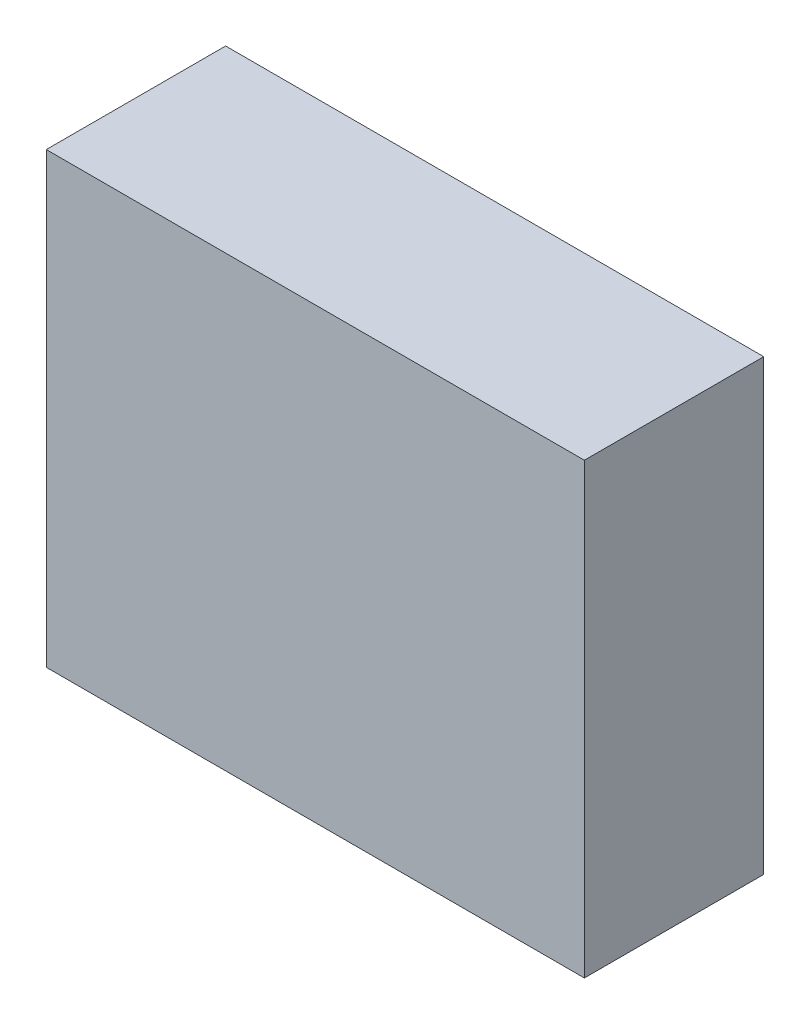
ISO-10303-21;
HEADER;
FILE_DESCRIPTION(('STEP AP214'),'2;1');
FILE_NAME('part.step','',(''),(''),'','','');
FILE_SCHEMA(('AUTOMOTIVE_DESIGN { 1 0 10303 214 1 1 1 1 }'));
ENDSEC;
DATA;
#1=APPLICATION_CONTEXT('core data for automotive mechanical design processes');
#2=APPLICATION_PROTOCOL_DEFINITION('international standard','automotive_design',2000,#1);
#3=PRODUCT_CONTEXT('',#1,'mechanical');
#4=PRODUCT('Part','Part','',(#3));
#5=PRODUCT_RELATED_PRODUCT_CATEGORY('part','',(#4));
#6=PRODUCT_DEFINITION_FORMATION('','',#4);
#7=PRODUCT_DEFINITION_CONTEXT('part definition',#1,'design');
#8=PRODUCT_DEFINITION('design','',#6,#7);
#9=PRODUCT_DEFINITION_SHAPE('','',#8);
#10=(LENGTH_UNIT() NAMED_UNIT(*) SI_UNIT(.MILLI.,.METRE.));
#11=(NAMED_UNIT(*) PLANE_ANGLE_UNIT() SI_UNIT($,.RADIAN.));
#12=(NAMED_UNIT(*) SI_UNIT($,.STERADIAN.) SOLID_ANGLE_UNIT());
#13=UNCERTAINTY_MEASURE_WITH_UNIT(LENGTH_MEASURE(1.E-05),#10,'distance_accuracy_value','');
#14=(GEOMETRIC_REPRESENTATION_CONTEXT(3) GLOBAL_UNCERTAINTY_ASSIGNED_CONTEXT((#13)) GLOBAL_UNIT_ASSIGNED_CONTEXT((#10,
#11,#12)) REPRESENTATION_CONTEXT('',''));
#15=CARTESIAN_POINT('',(0.,0.,0.));
#16=DIRECTION('',(0.,0.,1.));
#17=DIRECTION('',(1.,0.,0.));
#18=AXIS2_PLACEMENT_3D('',#15,#16,#17);
#19=CARTESIAN_POINT('',(-30.,40.,10.));
#20=DIRECTION('',(1.,0.,0.));
#21=DIRECTION('',(0.,0.,-1.));
#22=AXIS2_PLACEMENT_3D('',#19,#20,#21);
#23=PLANE('',#22);
#24=DIRECTION('',(0.,-1.,0.));
#25=VECTOR('',#24,1.);
#26=CARTESIAN_POINT('',(-30.,40.,-10.));
#27=LINE('',#26,#25);
#28=CARTESIAN_POINT('',(-30.,40.,-10.));
#29=VERTEX_POINT('',#28);
#30=CARTESIAN_POINT('',(-30.,-10.,-10.));
#31=VERTEX_POINT('',#30);
#32=EDGE_CURVE('E130',#29,#31,#27,.T.);
#33=ORIENTED_EDGE('',*,*,#32,.T.);
#34=DIRECTION('',(0.,0.,-1.));
#35=VECTOR('',#34,1.);
#36=CARTESIAN_POINT('',(-30.,-10.,10.));
#37=LINE('',#36,#35);
#38=CARTESIAN_POINT('',(-30.,-10.,10.));
#39=VERTEX_POINT('',#38);
#40=EDGE_CURVE('E179',#39,#31,#37,.T.);
#41=ORIENTED_EDGE('',*,*,#40,.F.);
#42=DIRECTION('',(0.,-1.,0.));
#43=VECTOR('',#42,1.);
#44=CARTESIAN_POINT('',(-30.,40.,10.));
#45=LINE('',#44,#43);
#46=CARTESIAN_POINT('',(-30.,40.,10.));
#47=VERTEX_POINT('',#46);
#48=EDGE_CURVE('E159',#47,#39,#45,.T.);
#49=ORIENTED_EDGE('',*,*,#48,.F.);
#50=DIRECTION('',(0.,0.,-1.));
#51=VECTOR('',#50,1.);
#52=CARTESIAN_POINT('',(-30.,40.,10.));
#53=LINE('',#52,#51);
#54=EDGE_CURVE('E165',#47,#29,#53,.T.);
#55=ORIENTED_EDGE('',*,*,#54,.T.);
#56=EDGE_LOOP('',(#33,#41,#49,#55));
#57=FACE_BOUND('',#56,.T.);
#58=ADVANCED_FACE('F41',(#57),#23,.F.);
#59=CARTESIAN_POINT('',(-30.,-10.,10.));
#60=DIRECTION('',(0.,1.,0.));
#61=DIRECTION('',(0.,0.,1.));
#62=AXIS2_PLACEMENT_3D('',#59,#60,#61);
#63=PLANE('',#62);
#64=DIRECTION('',(1.,0.,0.));
#65=VECTOR('',#64,1.);
#66=CARTESIAN_POINT('',(-30.,-10.,-10.));
#67=LINE('',#66,#65);
#68=CARTESIAN_POINT('',(30.,-10.,-10.));
#69=VERTEX_POINT('',#68);
#70=EDGE_CURVE('E168',#31,#69,#67,.T.);
#71=ORIENTED_EDGE('',*,*,#70,.T.);
#72=DIRECTION('',(0.,0.,-1.));
#73=VECTOR('',#72,1.);
#74=CARTESIAN_POINT('',(30.,-10.,10.));
#75=LINE('',#74,#73);
#76=CARTESIAN_POINT('',(30.,-10.,10.));
#77=VERTEX_POINT('',#76);
#78=EDGE_CURVE('E176',#77,#69,#75,.T.);
#79=ORIENTED_EDGE('',*,*,#78,.F.);
#80=DIRECTION('',(1.,0.,0.));
#81=VECTOR('',#80,1.);
#82=CARTESIAN_POINT('',(-30.,-10.,10.));
#83=LINE('',#82,#81);
#84=EDGE_CURVE('E93',#39,#77,#83,.T.);
#85=ORIENTED_EDGE('',*,*,#84,.F.);
#86=ORIENTED_EDGE('',*,*,#40,.T.);
#87=EDGE_LOOP('',(#71,#79,#85,#86));
#88=FACE_BOUND('',#87,.T.);
#89=ADVANCED_FACE('F207',(#88),#63,.F.);
#90=CARTESIAN_POINT('',(30.,-10.,10.));
#91=DIRECTION('',(-1.,0.,0.));
#92=DIRECTION('',(0.,0.,1.));
#93=AXIS2_PLACEMENT_3D('',#90,#91,#92);
#94=PLANE('',#93);
#95=DIRECTION('',(0.,1.,0.));
#96=VECTOR('',#95,1.);
#97=CARTESIAN_POINT('',(30.,-10.,-10.));
#98=LINE('',#97,#96);
#99=CARTESIAN_POINT('',(30.,40.,-10.));
#100=VERTEX_POINT('',#99);
#101=EDGE_CURVE('E170',#69,#100,#98,.T.);
#102=ORIENTED_EDGE('',*,*,#101,.T.);
#103=DIRECTION('',(0.,0.,-1.));
#104=VECTOR('',#103,1.);
#105=CARTESIAN_POINT('',(30.,40.,10.));
#106=LINE('',#105,#104);
#107=CARTESIAN_POINT('',(30.,40.,10.));
#108=VERTEX_POINT('',#107);
#109=EDGE_CURVE('E174',#108,#100,#106,.T.);
#110=ORIENTED_EDGE('',*,*,#109,.F.);
#111=DIRECTION('',(0.,1.,0.));
#112=VECTOR('',#111,1.);
#113=CARTESIAN_POINT('',(30.,-10.,10.));
#114=LINE('',#113,#112);
#115=EDGE_CURVE('E162',#77,#108,#114,.T.);
#116=ORIENTED_EDGE('',*,*,#115,.F.);
#117=ORIENTED_EDGE('',*,*,#78,.T.);
#118=EDGE_LOOP('',(#102,#110,#116,#117));
#119=FACE_BOUND('',#118,.T.);
#120=ADVANCED_FACE('F212',(#119),#94,.F.);
#121=CARTESIAN_POINT('',(30.,40.,10.));
#122=DIRECTION('',(0.,-1.,0.));
#123=DIRECTION('',(0.,0.,-1.));
#124=AXIS2_PLACEMENT_3D('',#121,#122,#123);
#125=PLANE('',#124);
#126=DIRECTION('',(-1.,0.,0.));
#127=VECTOR('',#126,1.);
#128=CARTESIAN_POINT('',(30.,40.,-10.));
#129=LINE('',#128,#127);
#130=EDGE_CURVE('E85',#100,#29,#129,.T.);
#131=ORIENTED_EDGE('',*,*,#130,.T.);
#132=ORIENTED_EDGE('',*,*,#54,.F.);
#133=DIRECTION('',(-1.,0.,0.));
#134=VECTOR('',#133,1.);
#135=CARTESIAN_POINT('',(30.,40.,10.));
#136=LINE('',#135,#134);
#137=EDGE_CURVE('E64',#108,#47,#136,.T.);
#138=ORIENTED_EDGE('',*,*,#137,.F.);
#139=ORIENTED_EDGE('',*,*,#109,.T.);
#140=EDGE_LOOP('',(#131,#132,#138,#139));
#141=FACE_BOUND('',#140,.T.);
#142=ADVANCED_FACE('F222',(#141),#125,.F.);
#143=CARTESIAN_POINT('',(0.,0.,10.));
#144=DIRECTION('',(0.,0.,1.));
#145=DIRECTION('',(1.,0.,0.));
#146=AXIS2_PLACEMENT_3D('',#143,#144,#145);
#147=PLANE('',#146);
#148=ORIENTED_EDGE('',*,*,#48,.T.);
#149=ORIENTED_EDGE('',*,*,#84,.T.);
#150=ORIENTED_EDGE('',*,*,#115,.T.);
#151=ORIENTED_EDGE('',*,*,#137,.T.);
#152=EDGE_LOOP('',(#148,#149,#150,#151));
#153=FACE_BOUND('',#152,.T.);
#154=ADVANCED_FACE('F220',(#153),#147,.T.);
#155=CARTESIAN_POINT('',(0.,0.,-10.));
#156=DIRECTION('',(0.,0.,1.));
#157=DIRECTION('',(1.,0.,0.));
#158=AXIS2_PLACEMENT_3D('',#155,#156,#157);
#159=PLANE('',#158);
#160=DIRECTION('',(0.,1.,0.));
#161=VECTOR('',#160,1.);
#162=CARTESIAN_POINT('',(-5.77350269189625,0.,-10.));
#163=LINE('',#162,#161);
#164=CARTESIAN_POINT('',(-5.77350269189625,0.,-10.));
#165=VERTEX_POINT('',#164);
#166=CARTESIAN_POINT('',(-5.77350269189626,30.,-10.));
#167=VERTEX_POINT('',#166);
#168=EDGE_CURVE('E181',#165,#167,#163,.T.);
#169=ORIENTED_EDGE('',*,*,#168,.F.);
#170=DIRECTION('',(1.,0.,0.));
#171=VECTOR('',#170,1.);
#172=CARTESIAN_POINT('',(0.,0.,-10.));
#173=LINE('',#172,#171);
#174=CARTESIAN_POINT('',(17.3205080756888,0.,-10.));
#175=VERTEX_POINT('',#174);
#176=EDGE_CURVE('E11',#165,#175,#173,.T.);
#177=ORIENTED_EDGE('',*,*,#176,.T.);
#178=DIRECTION('',(0.,-1.,0.));
#179=VECTOR('',#178,1.);
#180=CARTESIAN_POINT('',(17.3205080756888,0.,-10.));
#181=LINE('',#180,#179);
#182=CARTESIAN_POINT('',(17.3205080756888,30.,-10.));
#183=VERTEX_POINT('',#182);
#184=EDGE_CURVE('E48',#175,#183,#181,.F.);
#185=ORIENTED_EDGE('',*,*,#184,.T.);
#186=DIRECTION('',(-1.,0.,0.));
#187=VECTOR('',#186,1.);
#188=CARTESIAN_POINT('',(0.,30.,-10.));
#189=LINE('',#188,#187);
#190=EDGE_CURVE('E183',#183,#167,#189,.T.);
#191=ORIENTED_EDGE('',*,*,#190,.T.);
#192=EDGE_LOOP('',(#169,#177,#185,#191));
#193=FACE_BOUND('',#192,.T.);
#194=ORIENTED_EDGE('',*,*,#32,.F.);
#195=ORIENTED_EDGE('',*,*,#130,.F.);
#196=ORIENTED_EDGE('',*,*,#101,.F.);
#197=ORIENTED_EDGE('',*,*,#70,.F.);
#198=EDGE_LOOP('',(#194,#195,#196,#197));
#199=FACE_BOUND('',#198,.T.);
#200=ADVANCED_FACE('F188',(#193,#199),#159,.F.);
#201=CARTESIAN_POINT('',(-2.5,0.,-4.33012701892219));
#202=DIRECTION('',(0.,-1.,0.));
#203=DIRECTION('',(0.,0.,-1.));
#204=AXIS2_PLACEMENT_3D('',#201,#202,#203);
#205=PLANE('',#204);
#206=DIRECTION('',(-0.5,0.,-0.866025403784439));
#207=VECTOR('',#206,1.);
#208=CARTESIAN_POINT('',(-2.5,0.,-4.33012701892219));
#209=LINE('',#208,#207);
#210=CARTESIAN_POINT('',(-2.5,0.,-4.33012701892219));
#211=VERTEX_POINT('',#210);
#212=EDGE_CURVE('E55',#211,#165,#209,.T.);
#213=ORIENTED_EDGE('',*,*,#212,.F.);
#214=CARTESIAN_POINT('',(0.,0.,0.));
#215=DIRECTION('',(0.,-1.,0.));
#216=DIRECTION('',(0.,0.,-1.));
#217=AXIS2_PLACEMENT_3D('',#214,#215,#216);
#218=CIRCLE('',#217,5.);
#219=CARTESIAN_POINT('',(5.,0.,0.));
#220=VERTEX_POINT('',#219);
#221=EDGE_CURVE('E121',#211,#220,#218,.T.);
#222=ORIENTED_EDGE('',*,*,#221,.T.);
#223=DIRECTION('',(1.,0.,0.));
#224=VECTOR('',#223,1.);
#225=CARTESIAN_POINT('',(5.,0.,0.));
#226=LINE('',#225,#224);
#227=CARTESIAN_POINT('',(20.,0.,0.));
#228=VERTEX_POINT('',#227);
#229=EDGE_CURVE('E126',#220,#228,#226,.T.);
#230=ORIENTED_EDGE('',*,*,#229,.T.);
#231=CARTESIAN_POINT('',(0.,0.,0.));
#232=DIRECTION('',(0.,-1.,0.));
#233=DIRECTION('',(0.,0.,-1.));
#234=AXIS2_PLACEMENT_3D('',#231,#232,#233);
#235=CIRCLE('',#234,20.);
#236=EDGE_CURVE('E131',#175,#228,#235,.T.);
#237=ORIENTED_EDGE('',*,*,#236,.F.);
#238=ORIENTED_EDGE('',*,*,#176,.F.);
#239=EDGE_LOOP('',(#213,#222,#230,#237,#238));
#240=FACE_BOUND('',#239,.T.);
#241=ADVANCED_FACE('F123',(#240),#205,.F.);
#242=CARTESIAN_POINT('',(0.,0.,0.));
#243=DIRECTION('',(0.,-1.,0.));
#244=DIRECTION('',(0.,0.,-1.));
#245=AXIS2_PLACEMENT_3D('',#242,#243,#244);
#246=CYLINDRICAL_SURFACE('',#245,20.);
#247=ORIENTED_EDGE('',*,*,#236,.T.);
#248=DIRECTION('',(0.,1.,0.));
#249=VECTOR('',#248,1.);
#250=CARTESIAN_POINT('',(20.,0.,0.));
#251=LINE('',#250,#249);
#252=CARTESIAN_POINT('',(20.,30.,0.));
#253=VERTEX_POINT('',#252);
#254=EDGE_CURVE('E144',#228,#253,#251,.T.);
#255=ORIENTED_EDGE('',*,*,#254,.T.);
#256=CARTESIAN_POINT('',(0.,30.,0.));
#257=DIRECTION('',(0.,-1.,0.));
#258=DIRECTION('',(0.,0.,-1.));
#259=AXIS2_PLACEMENT_3D('',#256,#257,#258);
#260=CIRCLE('',#259,20.);
#261=EDGE_CURVE('E156',#183,#253,#260,.T.);
#262=ORIENTED_EDGE('',*,*,#261,.F.);
#263=ORIENTED_EDGE('',*,*,#184,.F.);
#264=EDGE_LOOP('',(#247,#255,#262,#263));
#265=FACE_BOUND('',#264,.T.);
#266=ADVANCED_FACE('F192',(#265),#246,.F.);
#267=CARTESIAN_POINT('',(-9.99999999999999,30.,-17.3205080756888));
#268=DIRECTION('',(0.,1.,0.));
#269=DIRECTION('',(0.,0.,1.));
#270=AXIS2_PLACEMENT_3D('',#267,#268,#269);
#271=PLANE('',#270);
#272=ORIENTED_EDGE('',*,*,#261,.T.);
#273=DIRECTION('',(-1.,0.,0.));
#274=VECTOR('',#273,1.);
#275=CARTESIAN_POINT('',(20.,30.,0.));
#276=LINE('',#275,#274);
#277=CARTESIAN_POINT('',(5.,30.,0.));
#278=VERTEX_POINT('',#277);
#279=EDGE_CURVE('E146',#253,#278,#276,.T.);
#280=ORIENTED_EDGE('',*,*,#279,.T.);
#281=CARTESIAN_POINT('',(0.,30.,0.));
#282=DIRECTION('',(0.,-1.,0.));
#283=DIRECTION('',(0.,0.,-1.));
#284=AXIS2_PLACEMENT_3D('',#281,#282,#283);
#285=CIRCLE('',#284,5.);
#286=CARTESIAN_POINT('',(-2.5,30.,-4.33012701892219));
#287=VERTEX_POINT('',#286);
#288=EDGE_CURVE('E137',#287,#278,#285,.T.);
#289=ORIENTED_EDGE('',*,*,#288,.F.);
#290=DIRECTION('',(0.5,0.,0.866025403784439));
#291=VECTOR('',#290,1.);
#292=CARTESIAN_POINT('',(-9.99999999999999,30.,-17.3205080756888));
#293=LINE('',#292,#291);
#294=EDGE_CURVE('E153',#167,#287,#293,.T.);
#295=ORIENTED_EDGE('',*,*,#294,.F.);
#296=ORIENTED_EDGE('',*,*,#190,.F.);
#297=EDGE_LOOP('',(#272,#280,#289,#295,#296));
#298=FACE_BOUND('',#297,.T.);
#299=ADVANCED_FACE('F196',(#298),#271,.F.);
#300=CARTESIAN_POINT('',(0.,0.,0.));
#301=DIRECTION('',(0.866025403784439,0.,-0.5));
#302=DIRECTION('',(-0.5,0.,-0.866025403784439));
#303=AXIS2_PLACEMENT_3D('',#300,#301,#302);
#304=PLANE('',#303);
#305=ORIENTED_EDGE('',*,*,#168,.T.);
#306=ORIENTED_EDGE('',*,*,#294,.T.);
#307=DIRECTION('',(0.,-1.,0.));
#308=VECTOR('',#307,1.);
#309=CARTESIAN_POINT('',(-2.5,30.,-4.33012701892219));
#310=LINE('',#309,#308);
#311=EDGE_CURVE('E150',#287,#211,#310,.T.);
#312=ORIENTED_EDGE('',*,*,#311,.T.);
#313=ORIENTED_EDGE('',*,*,#212,.T.);
#314=EDGE_LOOP('',(#305,#306,#312,#313));
#315=FACE_BOUND('',#314,.T.);
#316=ADVANCED_FACE('F194',(#315),#304,.T.);
#317=CARTESIAN_POINT('',(0.,0.,0.));
#318=DIRECTION('',(0.,-1.,0.));
#319=DIRECTION('',(0.,0.,-1.));
#320=AXIS2_PLACEMENT_3D('',#317,#318,#319);
#321=CYLINDRICAL_SURFACE('',#320,5.);
#322=ORIENTED_EDGE('',*,*,#221,.F.);
#323=ORIENTED_EDGE('',*,*,#311,.F.);
#324=ORIENTED_EDGE('',*,*,#288,.T.);
#325=DIRECTION('',(0.,-1.,0.));
#326=VECTOR('',#325,1.);
#327=CARTESIAN_POINT('',(5.,30.,0.));
#328=LINE('',#327,#326);
#329=EDGE_CURVE('E134',#278,#220,#328,.T.);
#330=ORIENTED_EDGE('',*,*,#329,.T.);
#331=EDGE_LOOP('',(#322,#323,#324,#330));
#332=FACE_BOUND('',#331,.T.);
#333=ADVANCED_FACE('F135',(#332),#321,.T.);
#334=CARTESIAN_POINT('',(0.,0.,0.));
#335=DIRECTION('',(0.,0.,1.));
#336=DIRECTION('',(1.,0.,0.));
#337=AXIS2_PLACEMENT_3D('',#334,#335,#336);
#338=PLANE('',#337);
#339=ORIENTED_EDGE('',*,*,#329,.F.);
#340=ORIENTED_EDGE('',*,*,#279,.F.);
#341=ORIENTED_EDGE('',*,*,#254,.F.);
#342=ORIENTED_EDGE('',*,*,#229,.F.);
#343=EDGE_LOOP('',(#339,#340,#341,#342));
#344=FACE_BOUND('',#343,.T.);
#345=ADVANCED_FACE('F142',(#344),#338,.F.);
#346=CLOSED_SHELL('',(#58,#89,#120,#142,#154,#200,#241,#266,#299,#316,#333,#345));
#347=MANIFOLD_SOLID_BREP('B2',#346);
#348=ADVANCED_BREP_SHAPE_REPRESENTATION('',(#18,#347),#14);
#349=SHAPE_DEFINITION_REPRESENTATION(#9,#348);
ENDSEC;
END-ISO-10303-21;
